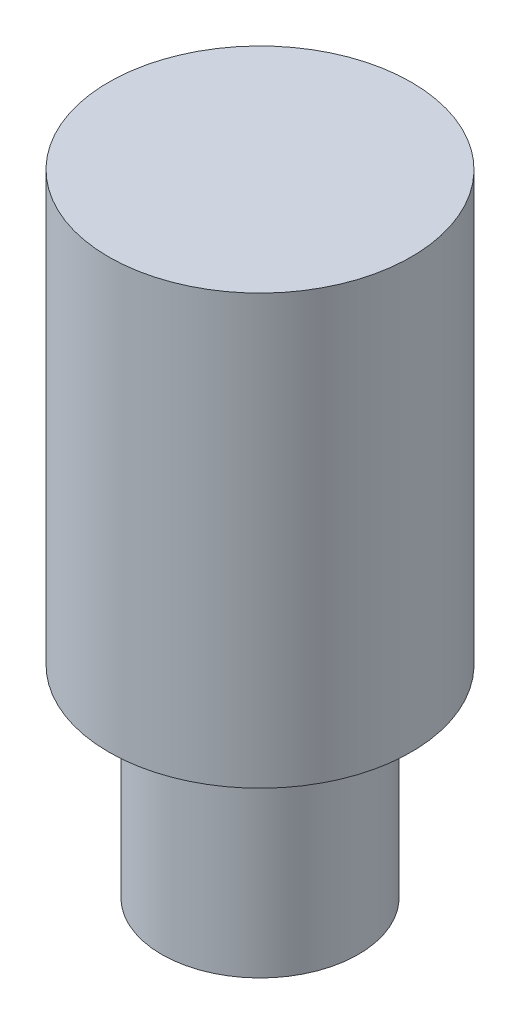
ISO-10303-21;
HEADER;
FILE_DESCRIPTION(('STEP AP214'),'2;1');
FILE_NAME('part.step','',(''),(''),'','','');
FILE_SCHEMA(('AUTOMOTIVE_DESIGN { 1 0 10303 214 1 1 1 1 }'));
ENDSEC;
DATA;
#1=APPLICATION_CONTEXT('core data for automotive mechanical design processes');
#2=APPLICATION_PROTOCOL_DEFINITION('international standard','automotive_design',2000,#1);
#3=PRODUCT_CONTEXT('',#1,'mechanical');
#4=PRODUCT('Part','Part','',(#3));
#5=PRODUCT_RELATED_PRODUCT_CATEGORY('part','',(#4));
#6=PRODUCT_DEFINITION_FORMATION('','',#4);
#7=PRODUCT_DEFINITION_CONTEXT('part definition',#1,'design');
#8=PRODUCT_DEFINITION('design','',#6,#7);
#9=PRODUCT_DEFINITION_SHAPE('','',#8);
#10=(LENGTH_UNIT() NAMED_UNIT(*) SI_UNIT(.MILLI.,.METRE.));
#11=(NAMED_UNIT(*) PLANE_ANGLE_UNIT() SI_UNIT($,.RADIAN.));
#12=(NAMED_UNIT(*) SI_UNIT($,.STERADIAN.) SOLID_ANGLE_UNIT());
#13=UNCERTAINTY_MEASURE_WITH_UNIT(LENGTH_MEASURE(1.E-05),#10,'distance_accuracy_value','');
#14=(GEOMETRIC_REPRESENTATION_CONTEXT(3) GLOBAL_UNCERTAINTY_ASSIGNED_CONTEXT((#13)) GLOBAL_UNIT_ASSIGNED_CONTEXT((#10,
#11,#12)) REPRESENTATION_CONTEXT('',''));
#15=CARTESIAN_POINT('',(0.,0.,0.));
#16=DIRECTION('',(0.,0.,1.));
#17=DIRECTION('',(1.,0.,0.));
#18=AXIS2_PLACEMENT_3D('',#15,#16,#17);
#19=CARTESIAN_POINT('',(0.,4.,0.));
#20=DIRECTION('',(0.,-1.,0.));
#21=DIRECTION('',(0.,0.,-1.));
#22=AXIS2_PLACEMENT_3D('',#19,#20,#21);
#23=CYLINDRICAL_SURFACE('',#22,1.95);
#24=CARTESIAN_POINT('',(0.,4.,0.));
#25=DIRECTION('',(0.,1.,0.));
#26=DIRECTION('',(0.,0.,1.));
#27=AXIS2_PLACEMENT_3D('',#24,#25,#26);
#28=CIRCLE('',#27,1.95);
#29=CARTESIAN_POINT('',(0.,4.,1.95));
#30=VERTEX_POINT('',#29);
#31=EDGE_CURVE('E10',#30,#30,#28,.T.);
#32=ORIENTED_EDGE('',*,*,#31,.F.);
#33=EDGE_LOOP('',(#32));
#34=FACE_BOUND('',#33,.T.);
#35=CARTESIAN_POINT('',(0.,0.,0.));
#36=DIRECTION('',(0.,1.,0.));
#37=DIRECTION('',(0.,0.,1.));
#38=AXIS2_PLACEMENT_3D('',#35,#36,#37);
#39=CIRCLE('',#38,1.95);
#40=CARTESIAN_POINT('',(0.,0.,1.95));
#41=VERTEX_POINT('',#40);
#42=EDGE_CURVE('E35',#41,#41,#39,.T.);
#43=ORIENTED_EDGE('',*,*,#42,.T.);
#44=EDGE_LOOP('',(#43));
#45=FACE_BOUND('',#44,.T.);
#46=ADVANCED_FACE('F32',(#34,#45),#23,.T.);
#47=CARTESIAN_POINT('',(0.,0.,0.));
#48=DIRECTION('',(0.,1.,0.));
#49=DIRECTION('',(0.,0.,1.));
#50=AXIS2_PLACEMENT_3D('',#47,#48,#49);
#51=PLANE('',#50);
#52=ORIENTED_EDGE('',*,*,#42,.F.);
#53=EDGE_LOOP('',(#52));
#54=FACE_BOUND('',#53,.T.);
#55=ADVANCED_FACE('F55',(#54),#51,.F.);
#56=CARTESIAN_POINT('',(0.,12.5,0.));
#57=DIRECTION('',(0.,-1.,0.));
#58=DIRECTION('',(0.,0.,-1.));
#59=AXIS2_PLACEMENT_3D('',#56,#57,#58);
#60=CYLINDRICAL_SURFACE('',#59,3.);
#61=CARTESIAN_POINT('',(0.,12.5,0.));
#62=DIRECTION('',(0.,1.,0.));
#63=DIRECTION('',(0.,0.,1.));
#64=AXIS2_PLACEMENT_3D('',#61,#62,#63);
#65=CIRCLE('',#64,3.);
#66=CARTESIAN_POINT('',(0.,12.5,3.));
#67=VERTEX_POINT('',#66);
#68=EDGE_CURVE('E42',#67,#67,#65,.T.);
#69=ORIENTED_EDGE('',*,*,#68,.F.);
#70=EDGE_LOOP('',(#69));
#71=FACE_BOUND('',#70,.T.);
#72=CARTESIAN_POINT('',(0.,4.,0.));
#73=DIRECTION('',(0.,1.,0.));
#74=DIRECTION('',(0.,0.,1.));
#75=AXIS2_PLACEMENT_3D('',#72,#73,#74);
#76=CIRCLE('',#75,3.);
#77=CARTESIAN_POINT('',(0.,4.,3.));
#78=VERTEX_POINT('',#77);
#79=EDGE_CURVE('E44',#78,#78,#76,.T.);
#80=ORIENTED_EDGE('',*,*,#79,.T.);
#81=EDGE_LOOP('',(#80));
#82=FACE_BOUND('',#81,.T.);
#83=ADVANCED_FACE('F52',(#71,#82),#60,.T.);
#84=CARTESIAN_POINT('',(0.,12.5,0.));
#85=DIRECTION('',(0.,1.,0.));
#86=DIRECTION('',(0.,0.,1.));
#87=AXIS2_PLACEMENT_3D('',#84,#85,#86);
#88=PLANE('',#87);
#89=ORIENTED_EDGE('',*,*,#68,.T.);
#90=EDGE_LOOP('',(#89));
#91=FACE_BOUND('',#90,.T.);
#92=ADVANCED_FACE('F50',(#91),#88,.T.);
#93=CARTESIAN_POINT('',(0.,4.,0.));
#94=DIRECTION('',(0.,1.,0.));
#95=DIRECTION('',(0.,0.,1.));
#96=AXIS2_PLACEMENT_3D('',#93,#94,#95);
#97=PLANE('',#96);
#98=ORIENTED_EDGE('',*,*,#31,.T.);
#99=EDGE_LOOP('',(#98));
#100=FACE_BOUND('',#99,.T.);
#101=ORIENTED_EDGE('',*,*,#79,.F.);
#102=EDGE_LOOP('',(#101));
#103=FACE_BOUND('',#102,.T.);
#104=ADVANCED_FACE('F59',(#100,#103),#97,.F.);
#105=CLOSED_SHELL('',(#46,#55,#83,#92,#104));
#106=MANIFOLD_SOLID_BREP('B2',#105);
#107=ADVANCED_BREP_SHAPE_REPRESENTATION('',(#18,#106),#14);
#108=SHAPE_DEFINITION_REPRESENTATION(#9,#107);
ENDSEC;
END-ISO-10303-21;
